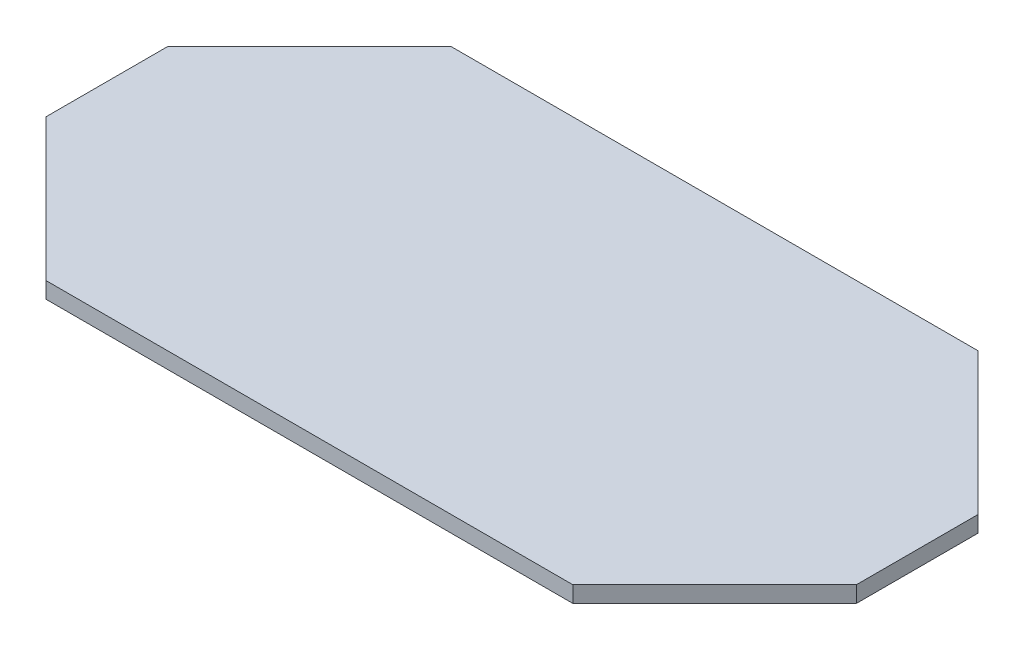
ISO-10303-21;
HEADER;
FILE_DESCRIPTION(('STEP AP214'),'2;1');
FILE_NAME('part.step','',(''),(''),'','','');
FILE_SCHEMA(('AUTOMOTIVE_DESIGN { 1 0 10303 214 1 1 1 1 }'));
ENDSEC;
DATA;
#1=APPLICATION_CONTEXT('core data for automotive mechanical design processes');
#2=APPLICATION_PROTOCOL_DEFINITION('international standard','automotive_design',2000,#1);
#3=PRODUCT_CONTEXT('',#1,'mechanical');
#4=PRODUCT('Part','Part','',(#3));
#5=PRODUCT_RELATED_PRODUCT_CATEGORY('part','',(#4));
#6=PRODUCT_DEFINITION_FORMATION('','',#4);
#7=PRODUCT_DEFINITION_CONTEXT('part definition',#1,'design');
#8=PRODUCT_DEFINITION('design','',#6,#7);
#9=PRODUCT_DEFINITION_SHAPE('','',#8);
#10=(LENGTH_UNIT() NAMED_UNIT(*) SI_UNIT(.MILLI.,.METRE.));
#11=(NAMED_UNIT(*) PLANE_ANGLE_UNIT() SI_UNIT($,.RADIAN.));
#12=(NAMED_UNIT(*) SI_UNIT($,.STERADIAN.) SOLID_ANGLE_UNIT());
#13=UNCERTAINTY_MEASURE_WITH_UNIT(LENGTH_MEASURE(1.E-05),#10,'distance_accuracy_value','');
#14=(GEOMETRIC_REPRESENTATION_CONTEXT(3) GLOBAL_UNCERTAINTY_ASSIGNED_CONTEXT((#13)) GLOBAL_UNIT_ASSIGNED_CONTEXT((#10,
#11,#12)) REPRESENTATION_CONTEXT('',''));
#15=CARTESIAN_POINT('',(0.,0.,0.));
#16=DIRECTION('',(0.,0.,1.));
#17=DIRECTION('',(1.,0.,0.));
#18=AXIS2_PLACEMENT_3D('',#15,#16,#17);
#19=CARTESIAN_POINT('',(-63.5,2.54,-31.75));
#20=DIRECTION('',(1.,0.,0.));
#21=DIRECTION('',(0.,0.,-1.));
#22=AXIS2_PLACEMENT_3D('',#19,#20,#21);
#23=PLANE('',#22);
#24=DIRECTION('',(0.,0.,1.));
#25=VECTOR('',#24,1.);
#26=CARTESIAN_POINT('',(-63.5,0.,-31.75));
#27=LINE('',#26,#25);
#28=CARTESIAN_POINT('',(-63.5,0.,-9.52500000000003));
#29=VERTEX_POINT('',#28);
#30=CARTESIAN_POINT('',(-63.5,0.,9.52499999999988));
#31=VERTEX_POINT('',#30);
#32=EDGE_CURVE('E129',#29,#31,#27,.T.);
#33=ORIENTED_EDGE('',*,*,#32,.T.);
#34=DIRECTION('',(0.,1.,0.));
#35=VECTOR('',#34,1.);
#36=CARTESIAN_POINT('',(-63.5,2.54,9.52499999999988));
#37=LINE('',#36,#35);
#38=CARTESIAN_POINT('',(-63.5,2.54,9.52499999999988));
#39=VERTEX_POINT('',#38);
#40=EDGE_CURVE('E11',#31,#39,#37,.T.);
#41=ORIENTED_EDGE('',*,*,#40,.T.);
#42=DIRECTION('',(0.,0.,1.));
#43=VECTOR('',#42,1.);
#44=CARTESIAN_POINT('',(-63.5,2.54,-31.75));
#45=LINE('',#44,#43);
#46=CARTESIAN_POINT('',(-63.5,2.54,-9.52500000000003));
#47=VERTEX_POINT('',#46);
#48=EDGE_CURVE('E127',#47,#39,#45,.T.);
#49=ORIENTED_EDGE('',*,*,#48,.F.);
#50=DIRECTION('',(0.,-1.,0.));
#51=VECTOR('',#50,1.);
#52=CARTESIAN_POINT('',(-63.5,2.54,-9.52500000000003));
#53=LINE('',#52,#51);
#54=EDGE_CURVE('E41',#47,#29,#53,.T.);
#55=ORIENTED_EDGE('',*,*,#54,.T.);
#56=EDGE_LOOP('',(#33,#41,#49,#55));
#57=FACE_BOUND('',#56,.T.);
#58=ADVANCED_FACE('F33',(#57),#23,.F.);
#59=CARTESIAN_POINT('',(-63.5,2.54,31.75));
#60=DIRECTION('',(0.,0.,-1.));
#61=DIRECTION('',(-1.,0.,0.));
#62=AXIS2_PLACEMENT_3D('',#59,#60,#61);
#63=PLANE('',#62);
#64=DIRECTION('',(1.,0.,0.));
#65=VECTOR('',#64,1.);
#66=CARTESIAN_POINT('',(-63.5,0.,31.75));
#67=LINE('',#66,#65);
#68=CARTESIAN_POINT('',(-41.275,0.,31.75));
#69=VERTEX_POINT('',#68);
#70=CARTESIAN_POINT('',(41.2749999999999,0.,31.75));
#71=VERTEX_POINT('',#70);
#72=EDGE_CURVE('E125',#69,#71,#67,.T.);
#73=ORIENTED_EDGE('',*,*,#72,.T.);
#74=DIRECTION('',(0.,1.,0.));
#75=VECTOR('',#74,1.);
#76=CARTESIAN_POINT('',(41.2749999999999,2.54,31.75));
#77=LINE('',#76,#75);
#78=CARTESIAN_POINT('',(41.2749999999999,2.54,31.75));
#79=VERTEX_POINT('',#78);
#80=EDGE_CURVE('E104',#71,#79,#77,.T.);
#81=ORIENTED_EDGE('',*,*,#80,.T.);
#82=DIRECTION('',(1.,0.,0.));
#83=VECTOR('',#82,1.);
#84=CARTESIAN_POINT('',(-63.5,2.54,31.75));
#85=LINE('',#84,#83);
#86=CARTESIAN_POINT('',(-41.275,2.54,31.75));
#87=VERTEX_POINT('',#86);
#88=EDGE_CURVE('E165',#87,#79,#85,.T.);
#89=ORIENTED_EDGE('',*,*,#88,.F.);
#90=DIRECTION('',(0.,-1.,0.));
#91=VECTOR('',#90,1.);
#92=CARTESIAN_POINT('',(-41.275,2.54,31.75));
#93=LINE('',#92,#91);
#94=EDGE_CURVE('E109',#87,#69,#93,.T.);
#95=ORIENTED_EDGE('',*,*,#94,.T.);
#96=EDGE_LOOP('',(#73,#81,#89,#95));
#97=FACE_BOUND('',#96,.T.);
#98=ADVANCED_FACE('F175',(#97),#63,.F.);
#99=CARTESIAN_POINT('',(63.5,2.54,-31.75));
#100=DIRECTION('',(-1.,0.,0.));
#101=DIRECTION('',(0.,0.,1.));
#102=AXIS2_PLACEMENT_3D('',#99,#100,#101);
#103=PLANE('',#102);
#104=DIRECTION('',(0.,0.,-1.));
#105=VECTOR('',#104,1.);
#106=CARTESIAN_POINT('',(63.5,2.54,-31.75));
#107=LINE('',#106,#105);
#108=CARTESIAN_POINT('',(63.5,2.54,9.52499999999997));
#109=VERTEX_POINT('',#108);
#110=CARTESIAN_POINT('',(63.5,2.54,-9.52499999999993));
#111=VERTEX_POINT('',#110);
#112=EDGE_CURVE('E118',#109,#111,#107,.T.);
#113=ORIENTED_EDGE('',*,*,#112,.F.);
#114=DIRECTION('',(0.,-1.,0.));
#115=VECTOR('',#114,1.);
#116=CARTESIAN_POINT('',(63.5,2.54,9.52499999999997));
#117=LINE('',#116,#115);
#118=CARTESIAN_POINT('',(63.5,0.,9.52499999999997));
#119=VERTEX_POINT('',#118);
#120=EDGE_CURVE('E103',#109,#119,#117,.T.);
#121=ORIENTED_EDGE('',*,*,#120,.T.);
#122=DIRECTION('',(0.,0.,-1.));
#123=VECTOR('',#122,1.);
#124=CARTESIAN_POINT('',(63.5,0.,-31.75));
#125=LINE('',#124,#123);
#126=CARTESIAN_POINT('',(63.5,0.,-9.52499999999993));
#127=VERTEX_POINT('',#126);
#128=EDGE_CURVE('E116',#119,#127,#125,.T.);
#129=ORIENTED_EDGE('',*,*,#128,.T.);
#130=DIRECTION('',(0.,1.,0.));
#131=VECTOR('',#130,1.);
#132=CARTESIAN_POINT('',(63.5,2.54,-9.52499999999993));
#133=LINE('',#132,#131);
#134=EDGE_CURVE('E120',#127,#111,#133,.T.);
#135=ORIENTED_EDGE('',*,*,#134,.T.);
#136=EDGE_LOOP('',(#113,#121,#129,#135));
#137=FACE_BOUND('',#136,.T.);
#138=ADVANCED_FACE('F115',(#137),#103,.F.);
#139=CARTESIAN_POINT('',(-63.5,2.54,-31.75));
#140=DIRECTION('',(0.,0.,1.));
#141=DIRECTION('',(1.,0.,0.));
#142=AXIS2_PLACEMENT_3D('',#139,#140,#141);
#143=PLANE('',#142);
#144=DIRECTION('',(-1.,0.,0.));
#145=VECTOR('',#144,1.);
#146=CARTESIAN_POINT('',(-63.5,2.54,-31.75));
#147=LINE('',#146,#145);
#148=CARTESIAN_POINT('',(41.275,2.54,-31.75));
#149=VERTEX_POINT('',#148);
#150=CARTESIAN_POINT('',(-41.2749999999999,2.54,-31.75));
#151=VERTEX_POINT('',#150);
#152=EDGE_CURVE('E133',#149,#151,#147,.T.);
#153=ORIENTED_EDGE('',*,*,#152,.F.);
#154=DIRECTION('',(0.,-1.,0.));
#155=VECTOR('',#154,1.);
#156=CARTESIAN_POINT('',(41.275,2.54,-31.75));
#157=LINE('',#156,#155);
#158=CARTESIAN_POINT('',(41.275,0.,-31.75));
#159=VERTEX_POINT('',#158);
#160=EDGE_CURVE('E150',#149,#159,#157,.T.);
#161=ORIENTED_EDGE('',*,*,#160,.T.);
#162=DIRECTION('',(-1.,0.,0.));
#163=VECTOR('',#162,1.);
#164=CARTESIAN_POINT('',(-63.5,0.,-31.75));
#165=LINE('',#164,#163);
#166=CARTESIAN_POINT('',(-41.2749999999999,0.,-31.75));
#167=VERTEX_POINT('',#166);
#168=EDGE_CURVE('E124',#159,#167,#165,.T.);
#169=ORIENTED_EDGE('',*,*,#168,.T.);
#170=DIRECTION('',(0.,1.,0.));
#171=VECTOR('',#170,1.);
#172=CARTESIAN_POINT('',(-41.2749999999999,2.54,-31.75));
#173=LINE('',#172,#171);
#174=EDGE_CURVE('E48',#167,#151,#173,.T.);
#175=ORIENTED_EDGE('',*,*,#174,.T.);
#176=EDGE_LOOP('',(#153,#161,#169,#175));
#177=FACE_BOUND('',#176,.T.);
#178=ADVANCED_FACE('F179',(#177),#143,.F.);
#179=CARTESIAN_POINT('',(0.,2.54,0.));
#180=DIRECTION('',(0.,1.,0.));
#181=DIRECTION('',(0.,0.,1.));
#182=AXIS2_PLACEMENT_3D('',#179,#180,#181);
#183=PLANE('',#182);
#184=ORIENTED_EDGE('',*,*,#88,.T.);
#185=DIRECTION('',(-0.707106781186549,0.,0.707106781186546));
#186=VECTOR('',#185,1.);
#187=CARTESIAN_POINT('',(36.5124999999999,2.54,36.5125));
#188=LINE('',#187,#186);
#189=EDGE_CURVE('E147',#79,#109,#188,.F.);
#190=ORIENTED_EDGE('',*,*,#189,.T.);
#191=ORIENTED_EDGE('',*,*,#112,.T.);
#192=DIRECTION('',(0.707106781186546,0.,0.707106781186549));
#193=VECTOR('',#192,1.);
#194=CARTESIAN_POINT('',(36.5125000000001,2.54,-36.5124999999999));
#195=LINE('',#194,#193);
#196=EDGE_CURVE('E55',#111,#149,#195,.F.);
#197=ORIENTED_EDGE('',*,*,#196,.T.);
#198=ORIENTED_EDGE('',*,*,#152,.T.);
#199=DIRECTION('',(0.707106781186549,0.,-0.707106781186546));
#200=VECTOR('',#199,1.);
#201=CARTESIAN_POINT('',(-36.5124999999999,2.54,-36.5125));
#202=LINE('',#201,#200);
#203=EDGE_CURVE('E142',#151,#47,#202,.F.);
#204=ORIENTED_EDGE('',*,*,#203,.T.);
#205=ORIENTED_EDGE('',*,*,#48,.T.);
#206=DIRECTION('',(-0.707106781186546,0.,-0.707106781186549));
#207=VECTOR('',#206,1.);
#208=CARTESIAN_POINT('',(-36.5125,2.54,36.5124999999999));
#209=LINE('',#208,#207);
#210=EDGE_CURVE('E144',#39,#87,#209,.F.);
#211=ORIENTED_EDGE('',*,*,#210,.T.);
#212=EDGE_LOOP('',(#184,#190,#191,#197,#198,#204,#205,#211));
#213=FACE_BOUND('',#212,.T.);
#214=ADVANCED_FACE('F169',(#213),#183,.T.);
#215=CARTESIAN_POINT('',(0.,0.,0.));
#216=DIRECTION('',(0.,1.,0.));
#217=DIRECTION('',(0.,0.,1.));
#218=AXIS2_PLACEMENT_3D('',#215,#216,#217);
#219=PLANE('',#218);
#220=ORIENTED_EDGE('',*,*,#128,.F.);
#221=DIRECTION('',(0.707106781186549,0.,-0.707106781186546));
#222=VECTOR('',#221,1.);
#223=CARTESIAN_POINT('',(63.5,0.,9.52499999999997));
#224=LINE('',#223,#222);
#225=EDGE_CURVE('E99',#119,#71,#224,.F.);
#226=ORIENTED_EDGE('',*,*,#225,.T.);
#227=ORIENTED_EDGE('',*,*,#72,.F.);
#228=DIRECTION('',(0.707106781186546,0.,0.707106781186549));
#229=VECTOR('',#228,1.);
#230=CARTESIAN_POINT('',(-41.275,0.,31.75));
#231=LINE('',#230,#229);
#232=EDGE_CURVE('E136',#69,#31,#231,.F.);
#233=ORIENTED_EDGE('',*,*,#232,.T.);
#234=ORIENTED_EDGE('',*,*,#32,.F.);
#235=DIRECTION('',(-0.707106781186549,0.,0.707106781186546));
#236=VECTOR('',#235,1.);
#237=CARTESIAN_POINT('',(-63.5,0.,-9.52500000000003));
#238=LINE('',#237,#236);
#239=EDGE_CURVE('E119',#29,#167,#238,.F.);
#240=ORIENTED_EDGE('',*,*,#239,.T.);
#241=ORIENTED_EDGE('',*,*,#168,.F.);
#242=DIRECTION('',(-0.707106781186546,0.,-0.707106781186549));
#243=VECTOR('',#242,1.);
#244=CARTESIAN_POINT('',(41.275,0.,-31.75));
#245=LINE('',#244,#243);
#246=EDGE_CURVE('E110',#159,#127,#245,.F.);
#247=ORIENTED_EDGE('',*,*,#246,.T.);
#248=EDGE_LOOP('',(#220,#226,#227,#233,#234,#240,#241,#247));
#249=FACE_BOUND('',#248,.T.);
#250=ADVANCED_FACE('F122',(#249),#219,.F.);
#251=CARTESIAN_POINT('',(63.5,2.54,9.52499999999997));
#252=DIRECTION('',(-0.707106781186546,0.,-0.707106781186549));
#253=DIRECTION('',(0.,-1.,0.));
#254=AXIS2_PLACEMENT_3D('',#251,#252,#253);
#255=PLANE('',#254);
#256=ORIENTED_EDGE('',*,*,#189,.F.);
#257=ORIENTED_EDGE('',*,*,#80,.F.);
#258=ORIENTED_EDGE('',*,*,#225,.F.);
#259=ORIENTED_EDGE('',*,*,#120,.F.);
#260=EDGE_LOOP('',(#256,#257,#258,#259));
#261=FACE_BOUND('',#260,.T.);
#262=ADVANCED_FACE('F102',(#261),#255,.F.);
#263=CARTESIAN_POINT('',(41.275,2.54,-31.75));
#264=DIRECTION('',(-0.707106781186549,0.,0.707106781186546));
#265=DIRECTION('',(0.,-1.,0.));
#266=AXIS2_PLACEMENT_3D('',#263,#264,#265);
#267=PLANE('',#266);
#268=ORIENTED_EDGE('',*,*,#196,.F.);
#269=ORIENTED_EDGE('',*,*,#134,.F.);
#270=ORIENTED_EDGE('',*,*,#246,.F.);
#271=ORIENTED_EDGE('',*,*,#160,.F.);
#272=EDGE_LOOP('',(#268,#269,#270,#271));
#273=FACE_BOUND('',#272,.T.);
#274=ADVANCED_FACE('F178',(#273),#267,.F.);
#275=CARTESIAN_POINT('',(-41.275,2.54,31.75));
#276=DIRECTION('',(0.707106781186549,0.,-0.707106781186546));
#277=DIRECTION('',(0.,-1.,0.));
#278=AXIS2_PLACEMENT_3D('',#275,#276,#277);
#279=PLANE('',#278);
#280=ORIENTED_EDGE('',*,*,#210,.F.);
#281=ORIENTED_EDGE('',*,*,#40,.F.);
#282=ORIENTED_EDGE('',*,*,#232,.F.);
#283=ORIENTED_EDGE('',*,*,#94,.F.);
#284=EDGE_LOOP('',(#280,#281,#282,#283));
#285=FACE_BOUND('',#284,.T.);
#286=ADVANCED_FACE('F173',(#285),#279,.F.);
#287=CARTESIAN_POINT('',(-63.5,2.54,-9.52500000000003));
#288=DIRECTION('',(0.707106781186546,0.,0.707106781186549));
#289=DIRECTION('',(0.,-1.,0.));
#290=AXIS2_PLACEMENT_3D('',#287,#288,#289);
#291=PLANE('',#290);
#292=ORIENTED_EDGE('',*,*,#203,.F.);
#293=ORIENTED_EDGE('',*,*,#174,.F.);
#294=ORIENTED_EDGE('',*,*,#239,.F.);
#295=ORIENTED_EDGE('',*,*,#54,.F.);
#296=EDGE_LOOP('',(#292,#293,#294,#295));
#297=FACE_BOUND('',#296,.T.);
#298=ADVANCED_FACE('F35',(#297),#291,.F.);
#299=CLOSED_SHELL('',(#58,#98,#138,#178,#214,#250,#262,#274,#286,#298));
#300=MANIFOLD_SOLID_BREP('B2',#299);
#301=ADVANCED_BREP_SHAPE_REPRESENTATION('',(#18,#300),#14);
#302=SHAPE_DEFINITION_REPRESENTATION(#9,#301);
ENDSEC;
END-ISO-10303-21;
